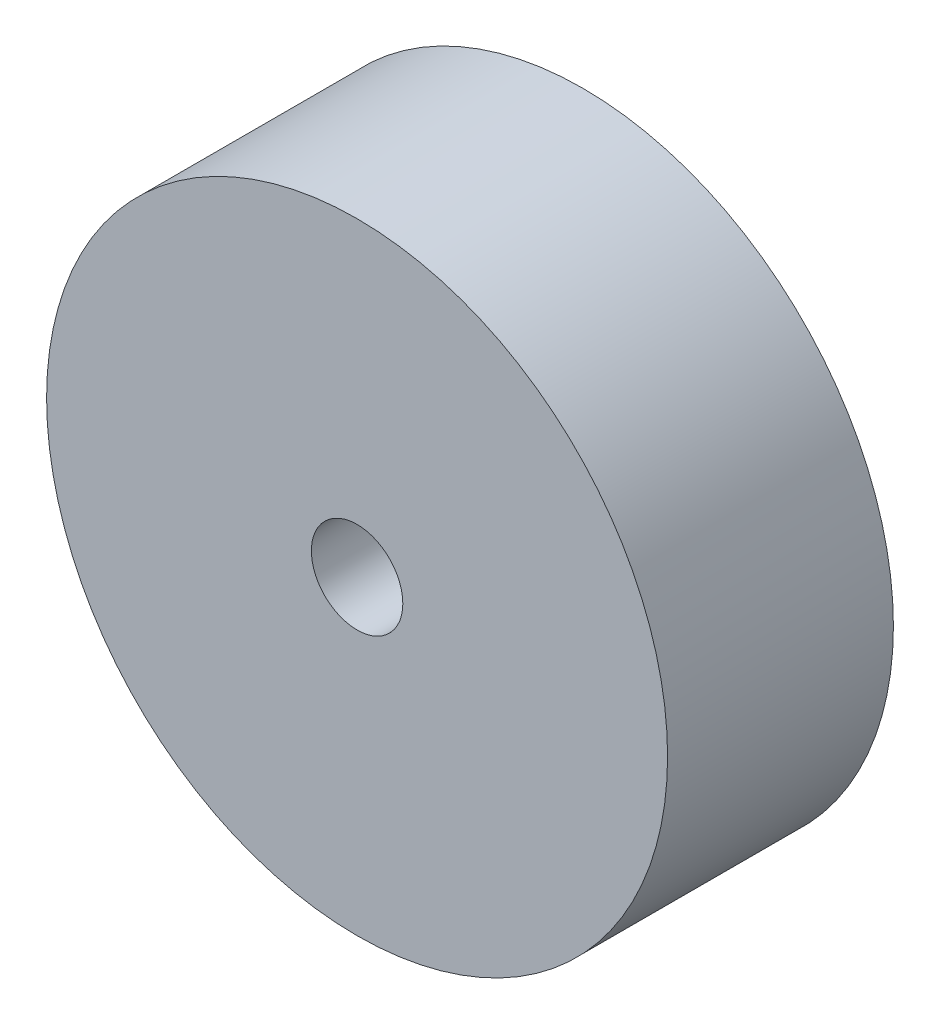
ISO-10303-21;
HEADER;
FILE_DESCRIPTION(('STEP AP214'),'2;1');
FILE_NAME('part.step','',(''),(''),'','','');
FILE_SCHEMA(('AUTOMOTIVE_DESIGN { 1 0 10303 214 1 1 1 1 }'));
ENDSEC;
DATA;
#1=APPLICATION_CONTEXT('core data for automotive mechanical design processes');
#2=APPLICATION_PROTOCOL_DEFINITION('international standard','automotive_design',2000,#1);
#3=PRODUCT_CONTEXT('',#1,'mechanical');
#4=PRODUCT('Part','Part','',(#3));
#5=PRODUCT_RELATED_PRODUCT_CATEGORY('part','',(#4));
#6=PRODUCT_DEFINITION_FORMATION('','',#4);
#7=PRODUCT_DEFINITION_CONTEXT('part definition',#1,'design');
#8=PRODUCT_DEFINITION('design','',#6,#7);
#9=PRODUCT_DEFINITION_SHAPE('','',#8);
#10=(LENGTH_UNIT() NAMED_UNIT(*) SI_UNIT(.MILLI.,.METRE.));
#11=(NAMED_UNIT(*) PLANE_ANGLE_UNIT() SI_UNIT($,.RADIAN.));
#12=(NAMED_UNIT(*) SI_UNIT($,.STERADIAN.) SOLID_ANGLE_UNIT());
#13=UNCERTAINTY_MEASURE_WITH_UNIT(LENGTH_MEASURE(1.E-05),#10,'distance_accuracy_value','');
#14=(GEOMETRIC_REPRESENTATION_CONTEXT(3) GLOBAL_UNCERTAINTY_ASSIGNED_CONTEXT((#13)) GLOBAL_UNIT_ASSIGNED_CONTEXT((#10,
#11,#12)) REPRESENTATION_CONTEXT('',''));
#15=CARTESIAN_POINT('',(0.,0.,0.));
#16=DIRECTION('',(0.,0.,1.));
#17=DIRECTION('',(1.,0.,0.));
#18=AXIS2_PLACEMENT_3D('',#15,#16,#17);
#19=CARTESIAN_POINT('',(0.,0.,10.));
#20=DIRECTION('',(0.,0.,-1.));
#21=DIRECTION('',(-1.,0.,0.));
#22=AXIS2_PLACEMENT_3D('',#19,#20,#21);
#23=CYLINDRICAL_SURFACE('',#22,27.5);
#24=CARTESIAN_POINT('',(0.,0.,10.));
#25=DIRECTION('',(0.,0.,1.));
#26=DIRECTION('',(1.,0.,0.));
#27=AXIS2_PLACEMENT_3D('',#24,#25,#26);
#28=CIRCLE('',#27,27.5);
#29=CARTESIAN_POINT('',(27.5,0.,10.));
#30=VERTEX_POINT('',#29);
#31=EDGE_CURVE('E10',#30,#30,#28,.T.);
#32=ORIENTED_EDGE('',*,*,#31,.F.);
#33=EDGE_LOOP('',(#32));
#34=FACE_BOUND('',#33,.T.);
#35=CARTESIAN_POINT('',(0.,0.,-10.));
#36=DIRECTION('',(0.,0.,1.));
#37=DIRECTION('',(1.,0.,0.));
#38=AXIS2_PLACEMENT_3D('',#35,#36,#37);
#39=CIRCLE('',#38,27.5);
#40=CARTESIAN_POINT('',(27.5,0.,-10.));
#41=VERTEX_POINT('',#40);
#42=EDGE_CURVE('E38',#41,#41,#39,.T.);
#43=ORIENTED_EDGE('',*,*,#42,.T.);
#44=EDGE_LOOP('',(#43));
#45=FACE_BOUND('',#44,.T.);
#46=ADVANCED_FACE('F31',(#34,#45),#23,.T.);
#47=CARTESIAN_POINT('',(0.,0.,10.));
#48=DIRECTION('',(0.,0.,1.));
#49=DIRECTION('',(1.,0.,0.));
#50=AXIS2_PLACEMENT_3D('',#47,#48,#49);
#51=PLANE('',#50);
#52=CARTESIAN_POINT('',(0.,0.,10.));
#53=DIRECTION('',(0.,0.,1.));
#54=DIRECTION('',(1.,0.,0.));
#55=AXIS2_PLACEMENT_3D('',#52,#53,#54);
#56=CIRCLE('',#55,4.05);
#57=CARTESIAN_POINT('',(4.05,0.,10.));
#58=VERTEX_POINT('',#57);
#59=EDGE_CURVE('E44',#58,#58,#56,.T.);
#60=ORIENTED_EDGE('',*,*,#59,.F.);
#61=EDGE_LOOP('',(#60));
#62=FACE_BOUND('',#61,.T.);
#63=ORIENTED_EDGE('',*,*,#31,.T.);
#64=EDGE_LOOP('',(#63));
#65=FACE_BOUND('',#64,.T.);
#66=ADVANCED_FACE('F60',(#62,#65),#51,.T.);
#67=CARTESIAN_POINT('',(0.,0.,-10.));
#68=DIRECTION('',(0.,0.,1.));
#69=DIRECTION('',(1.,0.,0.));
#70=AXIS2_PLACEMENT_3D('',#67,#68,#69);
#71=PLANE('',#70);
#72=CARTESIAN_POINT('',(0.,0.,-9.99999999999999));
#73=DIRECTION('',(0.,0.,1.));
#74=DIRECTION('',(1.,0.,0.));
#75=AXIS2_PLACEMENT_3D('',#72,#73,#74);
#76=CIRCLE('',#75,4.05);
#77=CARTESIAN_POINT('',(4.05,0.,-9.99999999999999));
#78=VERTEX_POINT('',#77);
#79=EDGE_CURVE('E34',#78,#78,#76,.T.);
#80=ORIENTED_EDGE('',*,*,#79,.T.);
#81=EDGE_LOOP('',(#80));
#82=FACE_BOUND('',#81,.T.);
#83=ORIENTED_EDGE('',*,*,#42,.F.);
#84=EDGE_LOOP('',(#83));
#85=FACE_BOUND('',#84,.T.);
#86=ADVANCED_FACE('F51',(#82,#85),#71,.F.);
#87=CARTESIAN_POINT('',(0.,0.,-98.));
#88=DIRECTION('',(0.,0.,1.));
#89=DIRECTION('',(1.,0.,0.));
#90=AXIS2_PLACEMENT_3D('',#87,#88,#89);
#91=CYLINDRICAL_SURFACE('',#90,4.05);
#92=ORIENTED_EDGE('',*,*,#59,.T.);
#93=EDGE_LOOP('',(#92));
#94=FACE_BOUND('',#93,.T.);
#95=ORIENTED_EDGE('',*,*,#79,.F.);
#96=EDGE_LOOP('',(#95));
#97=FACE_BOUND('',#96,.T.);
#98=ADVANCED_FACE('F54',(#94,#97),#91,.F.);
#99=CLOSED_SHELL('',(#46,#66,#86,#98));
#100=MANIFOLD_SOLID_BREP('B2',#99);
#101=ADVANCED_BREP_SHAPE_REPRESENTATION('',(#18,#100),#14);
#102=SHAPE_DEFINITION_REPRESENTATION(#9,#101);
ENDSEC;
END-ISO-10303-21;
